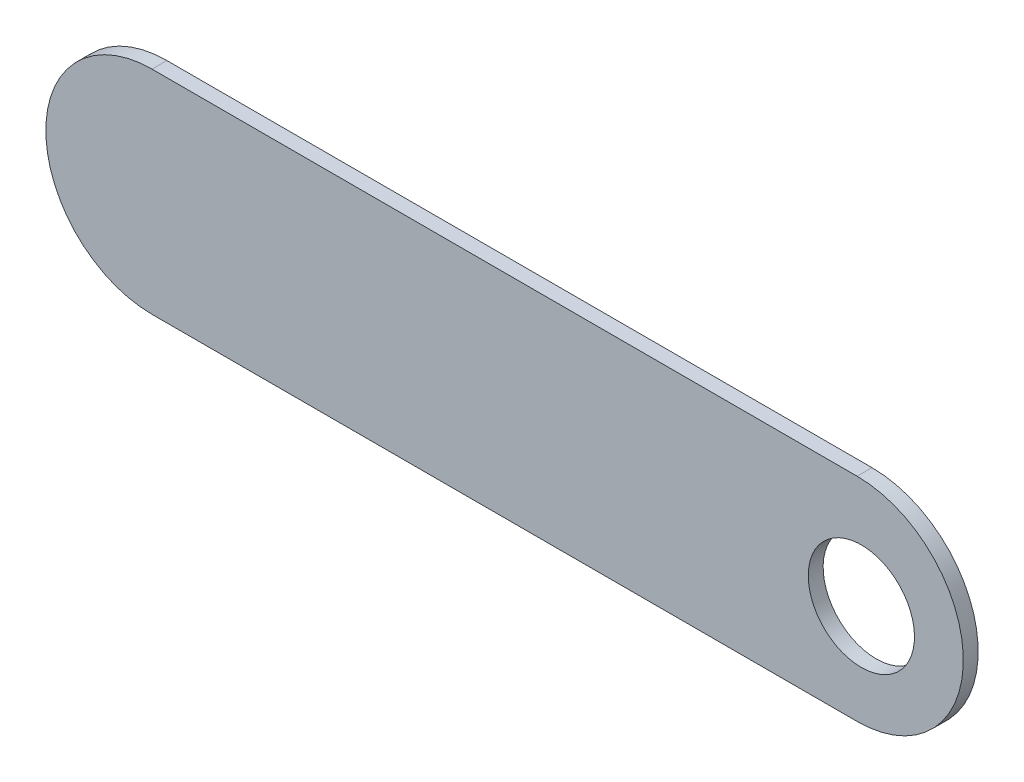
ISO-10303-21;
HEADER;
FILE_DESCRIPTION(('STEP AP214'),'2;1');
FILE_NAME('part.step','',(''),(''),'','','');
FILE_SCHEMA(('AUTOMOTIVE_DESIGN { 1 0 10303 214 1 1 1 1 }'));
ENDSEC;
DATA;
#1=APPLICATION_CONTEXT('core data for automotive mechanical design processes');
#2=APPLICATION_PROTOCOL_DEFINITION('international standard','automotive_design',2000,#1);
#3=PRODUCT_CONTEXT('',#1,'mechanical');
#4=PRODUCT('Part','Part','',(#3));
#5=PRODUCT_RELATED_PRODUCT_CATEGORY('part','',(#4));
#6=PRODUCT_DEFINITION_FORMATION('','',#4);
#7=PRODUCT_DEFINITION_CONTEXT('part definition',#1,'design');
#8=PRODUCT_DEFINITION('design','',#6,#7);
#9=PRODUCT_DEFINITION_SHAPE('','',#8);
#10=(LENGTH_UNIT() NAMED_UNIT(*) SI_UNIT(.MILLI.,.METRE.));
#11=(NAMED_UNIT(*) PLANE_ANGLE_UNIT() SI_UNIT($,.RADIAN.));
#12=(NAMED_UNIT(*) SI_UNIT($,.STERADIAN.) SOLID_ANGLE_UNIT());
#13=UNCERTAINTY_MEASURE_WITH_UNIT(LENGTH_MEASURE(1.E-05),#10,'distance_accuracy_value','');
#14=(GEOMETRIC_REPRESENTATION_CONTEXT(3) GLOBAL_UNCERTAINTY_ASSIGNED_CONTEXT((#13)) GLOBAL_UNIT_ASSIGNED_CONTEXT((#10,
#11,#12)) REPRESENTATION_CONTEXT('',''));
#15=CARTESIAN_POINT('',(0.,0.,0.));
#16=DIRECTION('',(0.,0.,1.));
#17=DIRECTION('',(1.,0.,0.));
#18=AXIS2_PLACEMENT_3D('',#15,#16,#17);
#19=CARTESIAN_POINT('',(118.67,-47.76,-0.045));
#20=DIRECTION('',(0.,0.,-1.));
#21=DIRECTION('',(0.,-1.,0.));
#22=AXIS2_PLACEMENT_3D('',#19,#20,#21);
#23=CYLINDRICAL_SURFACE('',#22,0.125);
#24=CARTESIAN_POINT('',(118.67,-47.76,1.6));
#25=DIRECTION('',(0.,0.,-1.));
#26=DIRECTION('',(0.,-1.,0.));
#27=AXIS2_PLACEMENT_3D('',#24,#25,#26);
#28=CIRCLE('',#27,0.125);
#29=CARTESIAN_POINT('',(118.67,-47.885,1.6));
#30=VERTEX_POINT('',#29);
#31=EDGE_CURVE('E20',#30,#30,#28,.T.);
#32=ORIENTED_EDGE('',*,*,#31,.T.);
#33=DIRECTION('',(0.,0.,1.));
#34=VECTOR('',#33,1.);
#35=CARTESIAN_POINT('',(118.67,-47.885,-0.045));
#36=LINE('',#35,#34);
#37=CARTESIAN_POINT('',(118.67,-47.885,1.635));
#38=VERTEX_POINT('',#37);
#39=EDGE_CURVE('E11',#30,#38,#36,.T.);
#40=ORIENTED_EDGE('',*,*,#39,.T.);
#41=CARTESIAN_POINT('',(118.67,-47.76,1.635));
#42=DIRECTION('',(0.,0.,-1.));
#43=DIRECTION('',(0.,-1.,0.));
#44=AXIS2_PLACEMENT_3D('',#41,#42,#43);
#45=CIRCLE('',#44,0.125);
#46=EDGE_CURVE('E27',#38,#38,#45,.T.);
#47=ORIENTED_EDGE('',*,*,#46,.F.);
#48=ORIENTED_EDGE('',*,*,#39,.F.);
#49=EDGE_LOOP('',(#32,#40,#47,#48));
#50=FACE_BOUND('',#49,.T.);
#51=ADVANCED_FACE('F17',(#50),#23,.F.);
#52=CARTESIAN_POINT('',(118.66,-47.5,1.6));
#53=DIRECTION('',(0.,-1.,0.));
#54=DIRECTION('',(0.,0.,-1.));
#55=AXIS2_PLACEMENT_3D('',#52,#53,#54);
#56=PLANE('',#55);
#57=DIRECTION('',(-1.,0.,0.));
#58=VECTOR('',#57,1.);
#59=CARTESIAN_POINT('',(118.66,-47.5,1.6));
#60=LINE('',#59,#58);
#61=CARTESIAN_POINT('',(118.66,-47.5,1.6));
#62=VERTEX_POINT('',#61);
#63=CARTESIAN_POINT('',(117.,-47.5,1.6));
#64=VERTEX_POINT('',#63);
#65=EDGE_CURVE('E125',#62,#64,#60,.T.);
#66=ORIENTED_EDGE('',*,*,#65,.T.);
#67=DIRECTION('',(0.,0.,1.));
#68=VECTOR('',#67,1.);
#69=CARTESIAN_POINT('',(117.,-47.5,1.6));
#70=LINE('',#69,#68);
#71=CARTESIAN_POINT('',(117.,-47.5,1.635));
#72=VERTEX_POINT('',#71);
#73=EDGE_CURVE('E87',#64,#72,#70,.T.);
#74=ORIENTED_EDGE('',*,*,#73,.T.);
#75=DIRECTION('',(-1.,0.,0.));
#76=VECTOR('',#75,1.);
#77=CARTESIAN_POINT('',(118.66,-47.5,1.635));
#78=LINE('',#77,#76);
#79=CARTESIAN_POINT('',(118.66,-47.5,1.635));
#80=VERTEX_POINT('',#79);
#81=EDGE_CURVE('E82',#80,#72,#78,.T.);
#82=ORIENTED_EDGE('',*,*,#81,.F.);
#83=DIRECTION('',(0.,0.,1.));
#84=VECTOR('',#83,1.);
#85=CARTESIAN_POINT('',(118.66,-47.5,1.6));
#86=LINE('',#85,#84);
#87=EDGE_CURVE('E118',#62,#80,#86,.T.);
#88=ORIENTED_EDGE('',*,*,#87,.F.);
#89=EDGE_LOOP('',(#66,#74,#82,#88));
#90=FACE_BOUND('',#89,.T.);
#91=ADVANCED_FACE('F151',(#90),#56,.F.);
#92=CARTESIAN_POINT('',(117.,-48.,1.635));
#93=DIRECTION('',(0.,0.,1.));
#94=DIRECTION('',(1.,0.,0.));
#95=AXIS2_PLACEMENT_3D('',#92,#93,#94);
#96=PLANE('',#95);
#97=ORIENTED_EDGE('',*,*,#46,.T.);
#98=EDGE_LOOP('',(#97));
#99=FACE_BOUND('',#98,.T.);
#100=DIRECTION('',(1.,0.,0.));
#101=VECTOR('',#100,1.);
#102=CARTESIAN_POINT('',(117.,-48.,1.635));
#103=LINE('',#102,#101);
#104=CARTESIAN_POINT('',(117.,-48.,1.635));
#105=VERTEX_POINT('',#104);
#106=CARTESIAN_POINT('',(118.66,-48.,1.635));
#107=VERTEX_POINT('',#106);
#108=EDGE_CURVE('E80',#105,#107,#103,.T.);
#109=ORIENTED_EDGE('',*,*,#108,.T.);
#110=CARTESIAN_POINT('',(118.66,-47.75,1.635));
#111=DIRECTION('',(0.,0.,1.));
#112=DIRECTION('',(0.,-1.,0.));
#113=AXIS2_PLACEMENT_3D('',#110,#111,#112);
#114=CIRCLE('',#113,0.25);
#115=EDGE_CURVE('E123',#107,#80,#114,.T.);
#116=ORIENTED_EDGE('',*,*,#115,.T.);
#117=ORIENTED_EDGE('',*,*,#81,.T.);
#118=CARTESIAN_POINT('',(117.,-47.75,1.635));
#119=DIRECTION('',(0.,0.,1.));
#120=DIRECTION('',(0.,1.,0.));
#121=AXIS2_PLACEMENT_3D('',#118,#119,#120);
#122=CIRCLE('',#121,0.25);
#123=EDGE_CURVE('E75',#72,#105,#122,.T.);
#124=ORIENTED_EDGE('',*,*,#123,.T.);
#125=EDGE_LOOP('',(#109,#116,#117,#124));
#126=FACE_BOUND('',#125,.T.);
#127=ADVANCED_FACE('F77',(#99,#126),#96,.T.);
#128=CARTESIAN_POINT('',(117.,-48.,1.6));
#129=DIRECTION('',(0.,0.,1.));
#130=DIRECTION('',(1.,0.,0.));
#131=AXIS2_PLACEMENT_3D('',#128,#129,#130);
#132=PLANE('',#131);
#133=ORIENTED_EDGE('',*,*,#31,.F.);
#134=EDGE_LOOP('',(#133));
#135=FACE_BOUND('',#134,.T.);
#136=CARTESIAN_POINT('',(117.,-47.75,1.6));
#137=DIRECTION('',(0.,0.,1.));
#138=DIRECTION('',(0.,1.,0.));
#139=AXIS2_PLACEMENT_3D('',#136,#137,#138);
#140=CIRCLE('',#139,0.25);
#141=CARTESIAN_POINT('',(117.,-48.,1.6));
#142=VERTEX_POINT('',#141);
#143=EDGE_CURVE('E88',#64,#142,#140,.T.);
#144=ORIENTED_EDGE('',*,*,#143,.F.);
#145=ORIENTED_EDGE('',*,*,#65,.F.);
#146=CARTESIAN_POINT('',(118.66,-47.75,1.6));
#147=DIRECTION('',(0.,0.,1.));
#148=DIRECTION('',(0.,-1.,0.));
#149=AXIS2_PLACEMENT_3D('',#146,#147,#148);
#150=CIRCLE('',#149,0.25);
#151=CARTESIAN_POINT('',(118.66,-48.,1.6));
#152=VERTEX_POINT('',#151);
#153=EDGE_CURVE('E114',#152,#62,#150,.T.);
#154=ORIENTED_EDGE('',*,*,#153,.F.);
#155=DIRECTION('',(1.,0.,0.));
#156=VECTOR('',#155,1.);
#157=CARTESIAN_POINT('',(117.,-48.,1.6));
#158=LINE('',#157,#156);
#159=EDGE_CURVE('E108',#142,#152,#158,.T.);
#160=ORIENTED_EDGE('',*,*,#159,.F.);
#161=EDGE_LOOP('',(#144,#145,#154,#160));
#162=FACE_BOUND('',#161,.T.);
#163=ADVANCED_FACE('F145',(#135,#162),#132,.F.);
#164=CARTESIAN_POINT('',(118.66,-47.75,1.6));
#165=DIRECTION('',(0.,0.,-1.));
#166=DIRECTION('',(0.,-1.,0.));
#167=AXIS2_PLACEMENT_3D('',#164,#165,#166);
#168=CYLINDRICAL_SURFACE('',#167,0.25);
#169=ORIENTED_EDGE('',*,*,#153,.T.);
#170=ORIENTED_EDGE('',*,*,#87,.T.);
#171=ORIENTED_EDGE('',*,*,#115,.F.);
#172=DIRECTION('',(0.,0.,1.));
#173=VECTOR('',#172,1.);
#174=CARTESIAN_POINT('',(118.66,-48.,1.6));
#175=LINE('',#174,#173);
#176=EDGE_CURVE('E101',#152,#107,#175,.T.);
#177=ORIENTED_EDGE('',*,*,#176,.F.);
#178=EDGE_LOOP('',(#169,#170,#171,#177));
#179=FACE_BOUND('',#178,.T.);
#180=ADVANCED_FACE('F148',(#179),#168,.T.);
#181=CARTESIAN_POINT('',(117.,-47.75,1.6));
#182=DIRECTION('',(0.,0.,-1.));
#183=DIRECTION('',(0.,1.,0.));
#184=AXIS2_PLACEMENT_3D('',#181,#182,#183);
#185=CYLINDRICAL_SURFACE('',#184,0.25);
#186=ORIENTED_EDGE('',*,*,#143,.T.);
#187=DIRECTION('',(0.,0.,1.));
#188=VECTOR('',#187,1.);
#189=CARTESIAN_POINT('',(117.,-48.,1.6));
#190=LINE('',#189,#188);
#191=EDGE_CURVE('E91',#142,#105,#190,.T.);
#192=ORIENTED_EDGE('',*,*,#191,.T.);
#193=ORIENTED_EDGE('',*,*,#123,.F.);
#194=ORIENTED_EDGE('',*,*,#73,.F.);
#195=EDGE_LOOP('',(#186,#192,#193,#194));
#196=FACE_BOUND('',#195,.T.);
#197=ADVANCED_FACE('F92',(#196),#185,.T.);
#198=CARTESIAN_POINT('',(117.,-48.,1.6));
#199=DIRECTION('',(0.,1.,0.));
#200=DIRECTION('',(1.,0.,0.));
#201=AXIS2_PLACEMENT_3D('',#198,#199,#200);
#202=PLANE('',#201);
#203=ORIENTED_EDGE('',*,*,#159,.T.);
#204=ORIENTED_EDGE('',*,*,#176,.T.);
#205=ORIENTED_EDGE('',*,*,#108,.F.);
#206=ORIENTED_EDGE('',*,*,#191,.F.);
#207=EDGE_LOOP('',(#203,#204,#205,#206));
#208=FACE_BOUND('',#207,.T.);
#209=ADVANCED_FACE('F99',(#208),#202,.F.);
#210=CLOSED_SHELL('',(#51,#91,#127,#163,#180,#197,#209));
#211=MANIFOLD_SOLID_BREP('B1',#210);
#212=ADVANCED_BREP_SHAPE_REPRESENTATION('',(#18,#211),#14);
#213=SHAPE_DEFINITION_REPRESENTATION(#9,#212);
ENDSEC;
END-ISO-10303-21;
